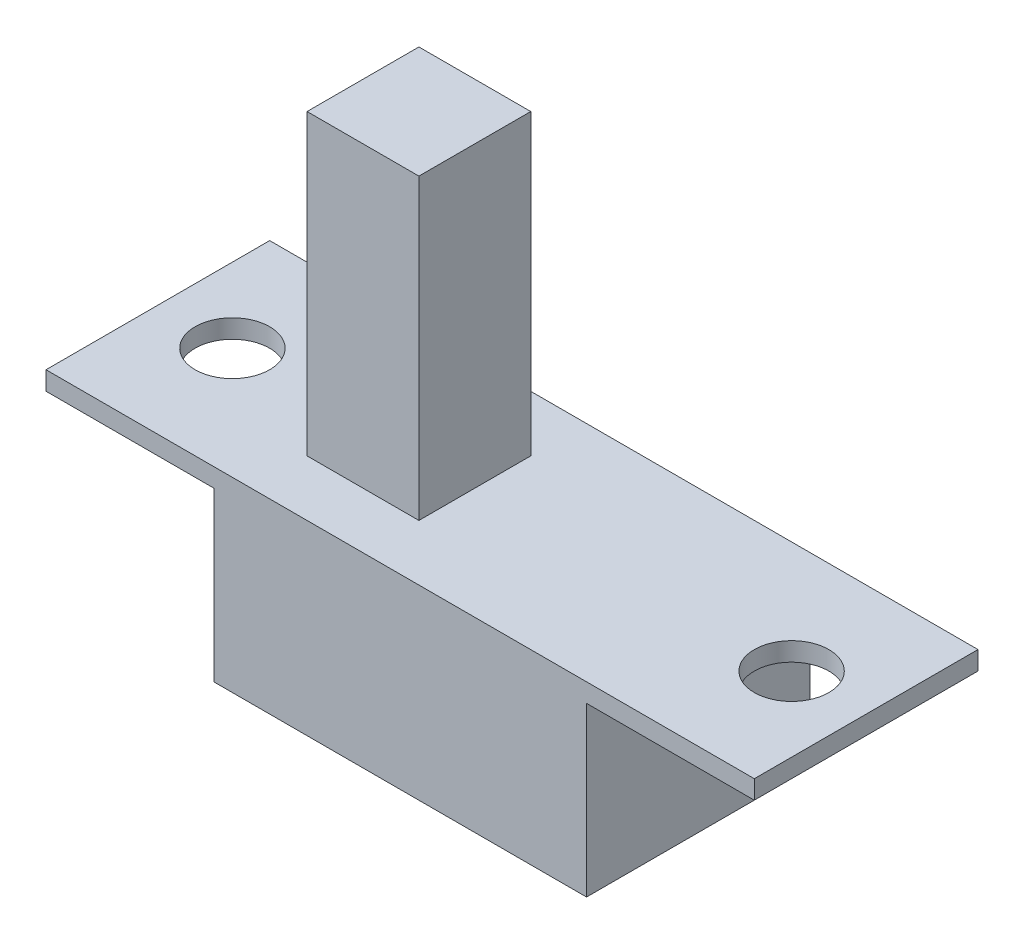
ISO-10303-21;
HEADER;
FILE_DESCRIPTION(('STEP AP214'),'2;1');
FILE_NAME('part.step','',(''),(''),'','','');
FILE_SCHEMA(('AUTOMOTIVE_DESIGN { 1 0 10303 214 1 1 1 1 }'));
ENDSEC;
DATA;
#1=APPLICATION_CONTEXT('core data for automotive mechanical design processes');
#2=APPLICATION_PROTOCOL_DEFINITION('international standard','automotive_design',2000,#1);
#3=PRODUCT_CONTEXT('',#1,'mechanical');
#4=PRODUCT('Part','Part','',(#3));
#5=PRODUCT_RELATED_PRODUCT_CATEGORY('part','',(#4));
#6=PRODUCT_DEFINITION_FORMATION('','',#4);
#7=PRODUCT_DEFINITION_CONTEXT('part definition',#1,'design');
#8=PRODUCT_DEFINITION('design','',#6,#7);
#9=PRODUCT_DEFINITION_SHAPE('','',#8);
#10=(LENGTH_UNIT() NAMED_UNIT(*) SI_UNIT(.MILLI.,.METRE.));
#11=(NAMED_UNIT(*) PLANE_ANGLE_UNIT() SI_UNIT($,.RADIAN.));
#12=(NAMED_UNIT(*) SI_UNIT($,.STERADIAN.) SOLID_ANGLE_UNIT());
#13=UNCERTAINTY_MEASURE_WITH_UNIT(LENGTH_MEASURE(1.E-05),#10,'distance_accuracy_value','');
#14=(GEOMETRIC_REPRESENTATION_CONTEXT(3) GLOBAL_UNCERTAINTY_ASSIGNED_CONTEXT((#13)) GLOBAL_UNIT_ASSIGNED_CONTEXT((#10,
#11,#12)) REPRESENTATION_CONTEXT('',''));
#15=CARTESIAN_POINT('',(0.,0.,0.));
#16=DIRECTION('',(0.,0.,1.));
#17=DIRECTION('',(1.,0.,0.));
#18=AXIS2_PLACEMENT_3D('',#15,#16,#17);
#19=CARTESIAN_POINT('',(0.,5.,0.));
#20=DIRECTION('',(0.,-1.,0.));
#21=DIRECTION('',(0.,0.,-1.));
#22=AXIS2_PLACEMENT_3D('',#19,#20,#21);
#23=PLANE('',#22);
#24=CARTESIAN_POINT('',(7.5,5.,0.));
#25=DIRECTION('',(0.,1.,0.));
#26=DIRECTION('',(0.,0.,1.));
#27=AXIS2_PLACEMENT_3D('',#24,#25,#26);
#28=CIRCLE('',#27,1.);
#29=CARTESIAN_POINT('',(7.5,5.,1.));
#30=VERTEX_POINT('',#29);
#31=EDGE_CURVE('E154',#30,#30,#28,.T.);
#32=ORIENTED_EDGE('',*,*,#31,.F.);
#33=EDGE_LOOP('',(#32));
#34=FACE_BOUND('',#33,.T.);
#35=CARTESIAN_POINT('',(-7.5,5.,0.));
#36=DIRECTION('',(0.,1.,0.));
#37=DIRECTION('',(0.,0.,1.));
#38=AXIS2_PLACEMENT_3D('',#35,#36,#37);
#39=CIRCLE('',#38,1.);
#40=CARTESIAN_POINT('',(-7.5,5.,1.));
#41=VERTEX_POINT('',#40);
#42=EDGE_CURVE('E167',#41,#41,#39,.T.);
#43=ORIENTED_EDGE('',*,*,#42,.F.);
#44=EDGE_LOOP('',(#43));
#45=FACE_BOUND('',#44,.T.);
#46=DIRECTION('',(1.,0.,0.));
#47=VECTOR('',#46,1.);
#48=CARTESIAN_POINT('',(-5.,5.,3.));
#49=LINE('',#48,#47);
#50=CARTESIAN_POINT('',(-9.5,5.,3.));
#51=VERTEX_POINT('',#50);
#52=CARTESIAN_POINT('',(9.5,5.,3.));
#53=VERTEX_POINT('',#52);
#54=EDGE_CURVE('E230',#51,#53,#49,.T.);
#55=ORIENTED_EDGE('',*,*,#54,.T.);
#56=DIRECTION('',(0.,0.,-1.));
#57=VECTOR('',#56,1.);
#58=CARTESIAN_POINT('',(9.5,5.,3.));
#59=LINE('',#58,#57);
#60=CARTESIAN_POINT('',(9.5,5.,-3.));
#61=VERTEX_POINT('',#60);
#62=EDGE_CURVE('E173',#53,#61,#59,.T.);
#63=ORIENTED_EDGE('',*,*,#62,.T.);
#64=DIRECTION('',(-1.,0.,0.));
#65=VECTOR('',#64,1.);
#66=CARTESIAN_POINT('',(-5.,5.,-3.));
#67=LINE('',#66,#65);
#68=CARTESIAN_POINT('',(-9.5,5.,-3.));
#69=VERTEX_POINT('',#68);
#70=EDGE_CURVE('E227',#61,#69,#67,.T.);
#71=ORIENTED_EDGE('',*,*,#70,.T.);
#72=DIRECTION('',(0.,0.,1.));
#73=VECTOR('',#72,1.);
#74=CARTESIAN_POINT('',(-9.5,5.,3.));
#75=LINE('',#74,#73);
#76=EDGE_CURVE('E182',#69,#51,#75,.T.);
#77=ORIENTED_EDGE('',*,*,#76,.T.);
#78=EDGE_LOOP('',(#55,#63,#71,#77));
#79=FACE_BOUND('',#78,.T.);
#80=DIRECTION('',(0.,0.,1.));
#81=VECTOR('',#80,1.);
#82=CARTESIAN_POINT('',(-3.99700922751117,5.,1.5));
#83=LINE('',#82,#81);
#84=CARTESIAN_POINT('',(-3.99700922751117,5.,-1.5));
#85=VERTEX_POINT('',#84);
#86=CARTESIAN_POINT('',(-3.99700922751117,5.,1.5));
#87=VERTEX_POINT('',#86);
#88=EDGE_CURVE('E152',#85,#87,#83,.T.);
#89=ORIENTED_EDGE('',*,*,#88,.F.);
#90=DIRECTION('',(-1.,0.,0.));
#91=VECTOR('',#90,1.);
#92=CARTESIAN_POINT('',(-0.997009227511171,5.,-1.5));
#93=LINE('',#92,#91);
#94=CARTESIAN_POINT('',(-0.997009227511171,5.,-1.5));
#95=VERTEX_POINT('',#94);
#96=EDGE_CURVE('E149',#95,#85,#93,.T.);
#97=ORIENTED_EDGE('',*,*,#96,.F.);
#98=DIRECTION('',(0.,0.,-1.));
#99=VECTOR('',#98,1.);
#100=CARTESIAN_POINT('',(-0.997009227511171,5.,1.5));
#101=LINE('',#100,#99);
#102=CARTESIAN_POINT('',(-0.997009227511171,5.,1.5));
#103=VERTEX_POINT('',#102);
#104=EDGE_CURVE('E62',#103,#95,#101,.T.);
#105=ORIENTED_EDGE('',*,*,#104,.F.);
#106=DIRECTION('',(1.,0.,0.));
#107=VECTOR('',#106,1.);
#108=CARTESIAN_POINT('',(-0.997009227511171,5.,1.5));
#109=LINE('',#108,#107);
#110=EDGE_CURVE('E57',#87,#103,#109,.T.);
#111=ORIENTED_EDGE('',*,*,#110,.F.);
#112=EDGE_LOOP('',(#89,#97,#105,#111));
#113=FACE_BOUND('',#112,.T.);
#114=ADVANCED_FACE('F41',(#34,#45,#79,#113),#23,.F.);
#115=CARTESIAN_POINT('',(5.,5.,3.));
#116=DIRECTION('',(-1.,0.,0.));
#117=DIRECTION('',(0.,0.,1.));
#118=AXIS2_PLACEMENT_3D('',#115,#116,#117);
#119=PLANE('',#118);
#120=DIRECTION('',(0.,-1.,0.));
#121=VECTOR('',#120,1.);
#122=CARTESIAN_POINT('',(5.,5.,-3.));
#123=LINE('',#122,#121);
#124=CARTESIAN_POINT('',(5.,4.5,-3.));
#125=VERTEX_POINT('',#124);
#126=CARTESIAN_POINT('',(5.,0.,-3.));
#127=VERTEX_POINT('',#126);
#128=EDGE_CURVE('E11',#125,#127,#123,.T.);
#129=ORIENTED_EDGE('',*,*,#128,.F.);
#130=DIRECTION('',(0.,0.,1.));
#131=VECTOR('',#130,1.);
#132=CARTESIAN_POINT('',(5.,4.5,3.));
#133=LINE('',#132,#131);
#134=CARTESIAN_POINT('',(5.,4.5,3.));
#135=VERTEX_POINT('',#134);
#136=EDGE_CURVE('E222',#125,#135,#133,.T.);
#137=ORIENTED_EDGE('',*,*,#136,.T.);
#138=DIRECTION('',(0.,-1.,0.));
#139=VECTOR('',#138,1.);
#140=CARTESIAN_POINT('',(5.,5.,3.));
#141=LINE('',#140,#139);
#142=CARTESIAN_POINT('',(5.,0.,3.));
#143=VERTEX_POINT('',#142);
#144=EDGE_CURVE('E234',#135,#143,#141,.T.);
#145=ORIENTED_EDGE('',*,*,#144,.T.);
#146=DIRECTION('',(0.,0.,-1.));
#147=VECTOR('',#146,1.);
#148=CARTESIAN_POINT('',(5.,0.,3.));
#149=LINE('',#148,#147);
#150=EDGE_CURVE('E226',#143,#127,#149,.T.);
#151=ORIENTED_EDGE('',*,*,#150,.T.);
#152=EDGE_LOOP('',(#129,#137,#145,#151));
#153=FACE_BOUND('',#152,.T.);
#154=ADVANCED_FACE('F43',(#153),#119,.F.);
#155=CARTESIAN_POINT('',(-5.,5.,-3.));
#156=DIRECTION('',(0.,0.,1.));
#157=DIRECTION('',(1.,0.,0.));
#158=AXIS2_PLACEMENT_3D('',#155,#156,#157);
#159=PLANE('',#158);
#160=DIRECTION('',(0.,-1.,0.));
#161=VECTOR('',#160,1.);
#162=CARTESIAN_POINT('',(-5.,5.,-3.));
#163=LINE('',#162,#161);
#164=CARTESIAN_POINT('',(-5.,4.5,-3.));
#165=VERTEX_POINT('',#164);
#166=CARTESIAN_POINT('',(-5.,0.,-3.));
#167=VERTEX_POINT('',#166);
#168=EDGE_CURVE('E50',#165,#167,#163,.T.);
#169=ORIENTED_EDGE('',*,*,#168,.F.);
#170=DIRECTION('',(-1.,0.,0.));
#171=VECTOR('',#170,1.);
#172=CARTESIAN_POINT('',(-9.5,4.5,-3.));
#173=LINE('',#172,#171);
#174=CARTESIAN_POINT('',(-9.5,4.5,-3.));
#175=VERTEX_POINT('',#174);
#176=EDGE_CURVE('E181',#165,#175,#173,.T.);
#177=ORIENTED_EDGE('',*,*,#176,.T.);
#178=DIRECTION('',(0.,1.,0.));
#179=VECTOR('',#178,1.);
#180=CARTESIAN_POINT('',(-9.5,4.5,-3.));
#181=LINE('',#180,#179);
#182=EDGE_CURVE('E212',#175,#69,#181,.T.);
#183=ORIENTED_EDGE('',*,*,#182,.T.);
#184=ORIENTED_EDGE('',*,*,#70,.F.);
#185=DIRECTION('',(0.,1.,0.));
#186=VECTOR('',#185,1.);
#187=CARTESIAN_POINT('',(9.5,4.5,-3.));
#188=LINE('',#187,#186);
#189=CARTESIAN_POINT('',(9.5,4.5,-3.));
#190=VERTEX_POINT('',#189);
#191=EDGE_CURVE('E196',#190,#61,#188,.T.);
#192=ORIENTED_EDGE('',*,*,#191,.F.);
#193=EDGE_CURVE('E183',#190,#125,#173,.T.);
#194=ORIENTED_EDGE('',*,*,#193,.T.);
#195=ORIENTED_EDGE('',*,*,#128,.T.);
#196=DIRECTION('',(-1.,0.,0.));
#197=VECTOR('',#196,1.);
#198=CARTESIAN_POINT('',(-5.,0.,-3.));
#199=LINE('',#198,#197);
#200=EDGE_CURVE('E238',#127,#167,#199,.T.);
#201=ORIENTED_EDGE('',*,*,#200,.T.);
#202=EDGE_LOOP('',(#169,#177,#183,#184,#192,#194,#195,#201));
#203=FACE_BOUND('',#202,.T.);
#204=ADVANCED_FACE('F262',(#203),#159,.F.);
#205=CARTESIAN_POINT('',(-5.,5.,3.));
#206=DIRECTION('',(1.,0.,0.));
#207=DIRECTION('',(0.,0.,-1.));
#208=AXIS2_PLACEMENT_3D('',#205,#206,#207);
#209=PLANE('',#208);
#210=DIRECTION('',(0.,-1.,0.));
#211=VECTOR('',#210,1.);
#212=CARTESIAN_POINT('',(-5.,5.,3.));
#213=LINE('',#212,#211);
#214=CARTESIAN_POINT('',(-5.,4.5,3.));
#215=VERTEX_POINT('',#214);
#216=CARTESIAN_POINT('',(-5.,0.,3.));
#217=VERTEX_POINT('',#216);
#218=EDGE_CURVE('E251',#215,#217,#213,.T.);
#219=ORIENTED_EDGE('',*,*,#218,.F.);
#220=DIRECTION('',(0.,0.,-1.));
#221=VECTOR('',#220,1.);
#222=CARTESIAN_POINT('',(-5.,4.5,3.));
#223=LINE('',#222,#221);
#224=EDGE_CURVE('E207',#215,#165,#223,.T.);
#225=ORIENTED_EDGE('',*,*,#224,.T.);
#226=ORIENTED_EDGE('',*,*,#168,.T.);
#227=DIRECTION('',(0.,0.,1.));
#228=VECTOR('',#227,1.);
#229=CARTESIAN_POINT('',(-5.,0.,3.));
#230=LINE('',#229,#228);
#231=EDGE_CURVE('E242',#167,#217,#230,.T.);
#232=ORIENTED_EDGE('',*,*,#231,.T.);
#233=EDGE_LOOP('',(#219,#225,#226,#232));
#234=FACE_BOUND('',#233,.T.);
#235=ADVANCED_FACE('F257',(#234),#209,.F.);
#236=CARTESIAN_POINT('',(-5.,5.,3.));
#237=DIRECTION('',(0.,0.,-1.));
#238=DIRECTION('',(-1.,0.,0.));
#239=AXIS2_PLACEMENT_3D('',#236,#237,#238);
#240=PLANE('',#239);
#241=ORIENTED_EDGE('',*,*,#144,.F.);
#242=DIRECTION('',(1.,0.,0.));
#243=VECTOR('',#242,1.);
#244=CARTESIAN_POINT('',(-9.5,4.5,3.));
#245=LINE('',#244,#243);
#246=CARTESIAN_POINT('',(9.5,4.5,3.));
#247=VERTEX_POINT('',#246);
#248=EDGE_CURVE('E191',#135,#247,#245,.T.);
#249=ORIENTED_EDGE('',*,*,#248,.T.);
#250=DIRECTION('',(0.,1.,0.));
#251=VECTOR('',#250,1.);
#252=CARTESIAN_POINT('',(9.5,4.5,3.));
#253=LINE('',#252,#251);
#254=EDGE_CURVE('E203',#247,#53,#253,.T.);
#255=ORIENTED_EDGE('',*,*,#254,.T.);
#256=ORIENTED_EDGE('',*,*,#54,.F.);
#257=DIRECTION('',(0.,1.,0.));
#258=VECTOR('',#257,1.);
#259=CARTESIAN_POINT('',(-9.5,4.5,3.));
#260=LINE('',#259,#258);
#261=CARTESIAN_POINT('',(-9.5,4.5,3.));
#262=VERTEX_POINT('',#261);
#263=EDGE_CURVE('E208',#262,#51,#260,.T.);
#264=ORIENTED_EDGE('',*,*,#263,.F.);
#265=EDGE_CURVE('E192',#262,#215,#245,.T.);
#266=ORIENTED_EDGE('',*,*,#265,.T.);
#267=ORIENTED_EDGE('',*,*,#218,.T.);
#268=DIRECTION('',(1.,0.,0.));
#269=VECTOR('',#268,1.);
#270=CARTESIAN_POINT('',(-5.,0.,3.));
#271=LINE('',#270,#269);
#272=EDGE_CURVE('E231',#217,#143,#271,.T.);
#273=ORIENTED_EDGE('',*,*,#272,.T.);
#274=EDGE_LOOP('',(#241,#249,#255,#256,#264,#266,#267,#273));
#275=FACE_BOUND('',#274,.T.);
#276=ADVANCED_FACE('F269',(#275),#240,.F.);
#277=CARTESIAN_POINT('',(0.,0.,0.));
#278=DIRECTION('',(0.,-1.,0.));
#279=DIRECTION('',(0.,0.,-1.));
#280=AXIS2_PLACEMENT_3D('',#277,#278,#279);
#281=PLANE('',#280);
#282=ORIENTED_EDGE('',*,*,#150,.F.);
#283=ORIENTED_EDGE('',*,*,#272,.F.);
#284=ORIENTED_EDGE('',*,*,#231,.F.);
#285=ORIENTED_EDGE('',*,*,#200,.F.);
#286=EDGE_LOOP('',(#282,#283,#284,#285));
#287=FACE_BOUND('',#286,.T.);
#288=ADVANCED_FACE('F266',(#287),#281,.T.);
#289=CARTESIAN_POINT('',(-9.5,4.5,3.));
#290=DIRECTION('',(-1.,0.,0.));
#291=DIRECTION('',(0.,0.,1.));
#292=AXIS2_PLACEMENT_3D('',#289,#290,#291);
#293=PLANE('',#292);
#294=ORIENTED_EDGE('',*,*,#76,.F.);
#295=ORIENTED_EDGE('',*,*,#182,.F.);
#296=DIRECTION('',(0.,0.,1.));
#297=VECTOR('',#296,1.);
#298=CARTESIAN_POINT('',(-9.5,4.5,3.));
#299=LINE('',#298,#297);
#300=EDGE_CURVE('E187',#175,#262,#299,.T.);
#301=ORIENTED_EDGE('',*,*,#300,.T.);
#302=ORIENTED_EDGE('',*,*,#263,.T.);
#303=EDGE_LOOP('',(#294,#295,#301,#302));
#304=FACE_BOUND('',#303,.T.);
#305=ADVANCED_FACE('F302',(#304),#293,.T.);
#306=CARTESIAN_POINT('',(-7.5,4.5,0.));
#307=DIRECTION('',(0.,1.,0.));
#308=DIRECTION('',(0.,0.,1.));
#309=AXIS2_PLACEMENT_3D('',#306,#307,#308);
#310=CYLINDRICAL_SURFACE('',#309,1.);
#311=CARTESIAN_POINT('',(-7.5,4.5,0.));
#312=DIRECTION('',(0.,1.,0.));
#313=DIRECTION('',(0.,0.,1.));
#314=AXIS2_PLACEMENT_3D('',#311,#312,#313);
#315=CIRCLE('',#314,1.);
#316=CARTESIAN_POINT('',(-7.5,4.5,1.));
#317=VERTEX_POINT('',#316);
#318=EDGE_CURVE('E169',#317,#317,#315,.T.);
#319=ORIENTED_EDGE('',*,*,#318,.F.);
#320=EDGE_LOOP('',(#319));
#321=FACE_BOUND('',#320,.T.);
#322=ORIENTED_EDGE('',*,*,#42,.T.);
#323=EDGE_LOOP('',(#322));
#324=FACE_BOUND('',#323,.T.);
#325=ADVANCED_FACE('F324',(#321,#324),#310,.F.);
#326=CARTESIAN_POINT('',(0.,4.5,0.));
#327=DIRECTION('',(0.,-1.,0.));
#328=DIRECTION('',(0.,0.,-1.));
#329=AXIS2_PLACEMENT_3D('',#326,#327,#328);
#330=PLANE('',#329);
#331=ORIENTED_EDGE('',*,*,#318,.T.);
#332=EDGE_LOOP('',(#331));
#333=FACE_BOUND('',#332,.T.);
#334=ORIENTED_EDGE('',*,*,#224,.F.);
#335=ORIENTED_EDGE('',*,*,#265,.F.);
#336=ORIENTED_EDGE('',*,*,#300,.F.);
#337=ORIENTED_EDGE('',*,*,#176,.F.);
#338=EDGE_LOOP('',(#334,#335,#336,#337));
#339=FACE_BOUND('',#338,.T.);
#340=ADVANCED_FACE('F273',(#333,#339),#330,.T.);
#341=CARTESIAN_POINT('',(7.5,4.5,0.));
#342=DIRECTION('',(0.,1.,0.));
#343=DIRECTION('',(0.,0.,1.));
#344=AXIS2_PLACEMENT_3D('',#341,#342,#343);
#345=CIRCLE('',#344,1.);
#346=CARTESIAN_POINT('',(7.5,4.5,1.));
#347=VERTEX_POINT('',#346);
#348=EDGE_CURVE('E159',#347,#347,#345,.T.);
#349=ORIENTED_EDGE('',*,*,#348,.T.);
#350=EDGE_LOOP('',(#349));
#351=FACE_BOUND('',#350,.T.);
#352=ORIENTED_EDGE('',*,*,#136,.F.);
#353=ORIENTED_EDGE('',*,*,#193,.F.);
#354=DIRECTION('',(0.,0.,-1.));
#355=VECTOR('',#354,1.);
#356=CARTESIAN_POINT('',(9.5,4.5,3.));
#357=LINE('',#356,#355);
#358=EDGE_CURVE('E177',#247,#190,#357,.T.);
#359=ORIENTED_EDGE('',*,*,#358,.F.);
#360=ORIENTED_EDGE('',*,*,#248,.F.);
#361=EDGE_LOOP('',(#352,#353,#359,#360));
#362=FACE_BOUND('',#361,.T.);
#363=ADVANCED_FACE('F284',(#351,#362),#330,.T.);
#364=CARTESIAN_POINT('',(9.5,4.5,3.));
#365=DIRECTION('',(1.,0.,0.));
#366=DIRECTION('',(0.,0.,-1.));
#367=AXIS2_PLACEMENT_3D('',#364,#365,#366);
#368=PLANE('',#367);
#369=ORIENTED_EDGE('',*,*,#62,.F.);
#370=ORIENTED_EDGE('',*,*,#254,.F.);
#371=ORIENTED_EDGE('',*,*,#358,.T.);
#372=ORIENTED_EDGE('',*,*,#191,.T.);
#373=EDGE_LOOP('',(#369,#370,#371,#372));
#374=FACE_BOUND('',#373,.T.);
#375=ADVANCED_FACE('F282',(#374),#368,.T.);
#376=CARTESIAN_POINT('',(7.5,4.5,0.));
#377=DIRECTION('',(0.,1.,0.));
#378=DIRECTION('',(0.,0.,1.));
#379=AXIS2_PLACEMENT_3D('',#376,#377,#378);
#380=CYLINDRICAL_SURFACE('',#379,1.);
#381=ORIENTED_EDGE('',*,*,#348,.F.);
#382=EDGE_LOOP('',(#381));
#383=FACE_BOUND('',#382,.T.);
#384=ORIENTED_EDGE('',*,*,#31,.T.);
#385=EDGE_LOOP('',(#384));
#386=FACE_BOUND('',#385,.T.);
#387=ADVANCED_FACE('F351',(#383,#386),#380,.F.);
#388=CARTESIAN_POINT('',(-3.99700922751117,13.,1.5));
#389=DIRECTION('',(1.,0.,0.));
#390=DIRECTION('',(0.,0.,-1.));
#391=AXIS2_PLACEMENT_3D('',#388,#389,#390);
#392=PLANE('',#391);
#393=ORIENTED_EDGE('',*,*,#88,.T.);
#394=DIRECTION('',(0.,-1.,0.));
#395=VECTOR('',#394,1.);
#396=CARTESIAN_POINT('',(-3.99700922751117,13.,1.5));
#397=LINE('',#396,#395);
#398=CARTESIAN_POINT('',(-3.99700922751117,13.,1.5));
#399=VERTEX_POINT('',#398);
#400=EDGE_CURVE('E131',#399,#87,#397,.T.);
#401=ORIENTED_EDGE('',*,*,#400,.F.);
#402=DIRECTION('',(0.,0.,1.));
#403=VECTOR('',#402,1.);
#404=CARTESIAN_POINT('',(-3.99700922751117,13.,1.5));
#405=LINE('',#404,#403);
#406=CARTESIAN_POINT('',(-3.99700922751117,13.,-1.5));
#407=VERTEX_POINT('',#406);
#408=EDGE_CURVE('E139',#407,#399,#405,.T.);
#409=ORIENTED_EDGE('',*,*,#408,.F.);
#410=DIRECTION('',(0.,-1.,0.));
#411=VECTOR('',#410,1.);
#412=CARTESIAN_POINT('',(-3.99700922751117,13.,-1.5));
#413=LINE('',#412,#411);
#414=EDGE_CURVE('E445',#407,#85,#413,.T.);
#415=ORIENTED_EDGE('',*,*,#414,.T.);
#416=EDGE_LOOP('',(#393,#401,#409,#415));
#417=FACE_BOUND('',#416,.T.);
#418=ADVANCED_FACE('F151',(#417),#392,.F.);
#419=CARTESIAN_POINT('',(-0.997009227511171,13.,1.5));
#420=DIRECTION('',(0.,0.,-1.));
#421=DIRECTION('',(-1.,0.,0.));
#422=AXIS2_PLACEMENT_3D('',#419,#420,#421);
#423=PLANE('',#422);
#424=ORIENTED_EDGE('',*,*,#110,.T.);
#425=DIRECTION('',(0.,-1.,0.));
#426=VECTOR('',#425,1.);
#427=CARTESIAN_POINT('',(-0.997009227511171,13.,1.5));
#428=LINE('',#427,#426);
#429=CARTESIAN_POINT('',(-0.997009227511171,13.,1.5));
#430=VERTEX_POINT('',#429);
#431=EDGE_CURVE('E134',#430,#103,#428,.T.);
#432=ORIENTED_EDGE('',*,*,#431,.F.);
#433=DIRECTION('',(1.,0.,0.));
#434=VECTOR('',#433,1.);
#435=CARTESIAN_POINT('',(-0.997009227511171,13.,1.5));
#436=LINE('',#435,#434);
#437=EDGE_CURVE('E127',#399,#430,#436,.T.);
#438=ORIENTED_EDGE('',*,*,#437,.F.);
#439=ORIENTED_EDGE('',*,*,#400,.T.);
#440=EDGE_LOOP('',(#424,#432,#438,#439));
#441=FACE_BOUND('',#440,.T.);
#442=ADVANCED_FACE('F129',(#441),#423,.F.);
#443=CARTESIAN_POINT('',(-0.997009227511171,13.,1.5));
#444=DIRECTION('',(-1.,0.,0.));
#445=DIRECTION('',(0.,0.,1.));
#446=AXIS2_PLACEMENT_3D('',#443,#444,#445);
#447=PLANE('',#446);
#448=ORIENTED_EDGE('',*,*,#104,.T.);
#449=DIRECTION('',(0.,-1.,0.));
#450=VECTOR('',#449,1.);
#451=CARTESIAN_POINT('',(-0.997009227511171,13.,-1.5));
#452=LINE('',#451,#450);
#453=CARTESIAN_POINT('',(-0.997009227511171,13.,-1.5));
#454=VERTEX_POINT('',#453);
#455=EDGE_CURVE('E161',#454,#95,#452,.T.);
#456=ORIENTED_EDGE('',*,*,#455,.F.);
#457=DIRECTION('',(0.,0.,-1.));
#458=VECTOR('',#457,1.);
#459=CARTESIAN_POINT('',(-0.997009227511171,13.,1.5));
#460=LINE('',#459,#458);
#461=EDGE_CURVE('E138',#430,#454,#460,.T.);
#462=ORIENTED_EDGE('',*,*,#461,.F.);
#463=ORIENTED_EDGE('',*,*,#431,.T.);
#464=EDGE_LOOP('',(#448,#456,#462,#463));
#465=FACE_BOUND('',#464,.T.);
#466=ADVANCED_FACE('F370',(#465),#447,.F.);
#467=CARTESIAN_POINT('',(-0.997009227511171,13.,-1.5));
#468=DIRECTION('',(0.,0.,1.));
#469=DIRECTION('',(1.,0.,0.));
#470=AXIS2_PLACEMENT_3D('',#467,#468,#469);
#471=PLANE('',#470);
#472=ORIENTED_EDGE('',*,*,#96,.T.);
#473=ORIENTED_EDGE('',*,*,#414,.F.);
#474=DIRECTION('',(-1.,0.,0.));
#475=VECTOR('',#474,1.);
#476=CARTESIAN_POINT('',(-0.997009227511171,13.,-1.5));
#477=LINE('',#476,#475);
#478=EDGE_CURVE('E144',#454,#407,#477,.T.);
#479=ORIENTED_EDGE('',*,*,#478,.F.);
#480=ORIENTED_EDGE('',*,*,#455,.T.);
#481=EDGE_LOOP('',(#472,#473,#479,#480));
#482=FACE_BOUND('',#481,.T.);
#483=ADVANCED_FACE('F377',(#482),#471,.F.);
#484=CARTESIAN_POINT('',(0.,13.,0.));
#485=DIRECTION('',(0.,1.,0.));
#486=DIRECTION('',(0.,0.,1.));
#487=AXIS2_PLACEMENT_3D('',#484,#485,#486);
#488=PLANE('',#487);
#489=ORIENTED_EDGE('',*,*,#408,.T.);
#490=ORIENTED_EDGE('',*,*,#437,.T.);
#491=ORIENTED_EDGE('',*,*,#461,.T.);
#492=ORIENTED_EDGE('',*,*,#478,.T.);
#493=EDGE_LOOP('',(#489,#490,#491,#492));
#494=FACE_BOUND('',#493,.T.);
#495=ADVANCED_FACE('F142',(#494),#488,.T.);
#496=CLOSED_SHELL('',(#114,#154,#204,#235,#276,#288,#305,#325,#340,#363,#375,#387,#418,#442,
#466,#483,#495));
#497=MANIFOLD_SOLID_BREP('B2',#496);
#498=ADVANCED_BREP_SHAPE_REPRESENTATION('',(#18,#497),#14);
#499=SHAPE_DEFINITION_REPRESENTATION(#9,#498);
ENDSEC;
END-ISO-10303-21;
